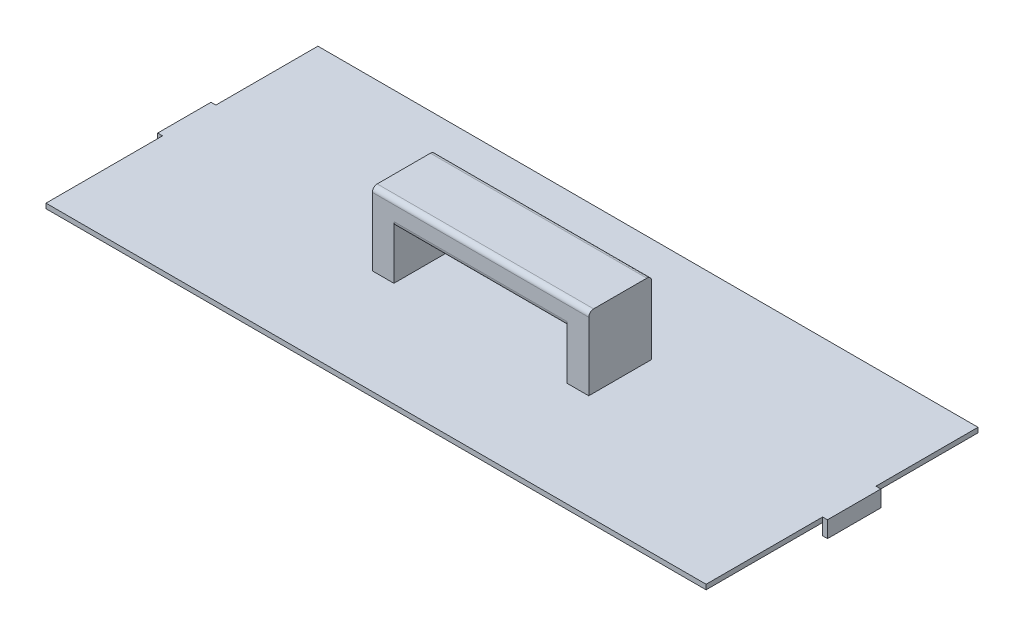
ISO-10303-21;
HEADER;
FILE_DESCRIPTION(('STEP AP214'),'2;1');
FILE_NAME('part.step','',(''),(''),'','','');
FILE_SCHEMA(('AUTOMOTIVE_DESIGN { 1 0 10303 214 1 1 1 1 }'));
ENDSEC;
DATA;
#1=APPLICATION_CONTEXT('core data for automotive mechanical design processes');
#2=APPLICATION_PROTOCOL_DEFINITION('international standard','automotive_design',2000,#1);
#3=PRODUCT_CONTEXT('',#1,'mechanical');
#4=PRODUCT('Part','Part','',(#3));
#5=PRODUCT_RELATED_PRODUCT_CATEGORY('part','',(#4));
#6=PRODUCT_DEFINITION_FORMATION('','',#4);
#7=PRODUCT_DEFINITION_CONTEXT('part definition',#1,'design');
#8=PRODUCT_DEFINITION('design','',#6,#7);
#9=PRODUCT_DEFINITION_SHAPE('','',#8);
#10=(LENGTH_UNIT() NAMED_UNIT(*) SI_UNIT(.MILLI.,.METRE.));
#11=(NAMED_UNIT(*) PLANE_ANGLE_UNIT() SI_UNIT($,.RADIAN.));
#12=(NAMED_UNIT(*) SI_UNIT($,.STERADIAN.) SOLID_ANGLE_UNIT());
#13=UNCERTAINTY_MEASURE_WITH_UNIT(LENGTH_MEASURE(1.E-05),#10,'distance_accuracy_value','');
#14=(GEOMETRIC_REPRESENTATION_CONTEXT(3) GLOBAL_UNCERTAINTY_ASSIGNED_CONTEXT((#13)) GLOBAL_UNIT_ASSIGNED_CONTEXT((#10,
#11,#12)) REPRESENTATION_CONTEXT('',''));
#15=CARTESIAN_POINT('',(0.,0.,0.));
#16=DIRECTION('',(0.,0.,1.));
#17=DIRECTION('',(1.,0.,0.));
#18=AXIS2_PLACEMENT_3D('',#15,#16,#17);
#19=CARTESIAN_POINT('',(76.9376083833033,1.,62.7820387129829));
#20=DIRECTION('',(-1.,0.,0.));
#21=DIRECTION('',(0.,0.,1.));
#22=AXIS2_PLACEMENT_3D('',#19,#20,#21);
#23=PLANE('',#22);
#24=DIRECTION('',(0.,1.,0.));
#25=VECTOR('',#24,1.);
#26=CARTESIAN_POINT('',(76.9376083833032,-2.37040463192349,29.8163482725759));
#27=LINE('',#26,#25);
#28=CARTESIAN_POINT('',(76.9376083833032,0.,29.8163482725759));
#29=VERTEX_POINT('',#28);
#30=CARTESIAN_POINT('',(76.937608383303,1.,29.8163482725759));
#31=VERTEX_POINT('',#30);
#32=EDGE_CURVE('E11',#29,#31,#27,.T.);
#33=ORIENTED_EDGE('',*,*,#32,.F.);
#34=DIRECTION('',(0.,0.,-1.));
#35=VECTOR('',#34,1.);
#36=CARTESIAN_POINT('',(76.9376083833033,0.,62.7820387129829));
#37=LINE('',#36,#35);
#38=CARTESIAN_POINT('',(76.9376083833031,0.,8.81087368901051));
#39=VERTEX_POINT('',#38);
#40=EDGE_CURVE('E384',#29,#39,#37,.T.);
#41=ORIENTED_EDGE('',*,*,#40,.T.);
#42=DIRECTION('',(0.,-1.,0.));
#43=VECTOR('',#42,1.);
#44=CARTESIAN_POINT('',(76.9376083833031,1.,8.81087368901051));
#45=LINE('',#44,#43);
#46=CARTESIAN_POINT('',(76.9376083833031,1.,8.81087368901051));
#47=VERTEX_POINT('',#46);
#48=EDGE_CURVE('E405',#47,#39,#45,.T.);
#49=ORIENTED_EDGE('',*,*,#48,.F.);
#50=DIRECTION('',(0.,0.,-1.));
#51=VECTOR('',#50,1.);
#52=CARTESIAN_POINT('',(76.9376083833033,1.,64.7684156513138));
#53=LINE('',#52,#51);
#54=EDGE_CURVE('E60',#31,#47,#53,.T.);
#55=ORIENTED_EDGE('',*,*,#54,.F.);
#56=EDGE_LOOP('',(#33,#41,#49,#55));
#57=FACE_BOUND('',#56,.T.);
#58=ADVANCED_FACE('F41',(#57),#23,.F.);
#59=DIRECTION('',(0.,-1.,0.));
#60=VECTOR('',#59,1.);
#61=CARTESIAN_POINT('',(76.9376083833032,1.,40.7849679925753));
#62=LINE('',#61,#60);
#63=CARTESIAN_POINT('',(76.9376083833031,1.,40.7849679925753));
#64=VERTEX_POINT('',#63);
#65=CARTESIAN_POINT('',(76.9376083833032,0.,40.7849679925753));
#66=VERTEX_POINT('',#65);
#67=EDGE_CURVE('E67',#64,#66,#62,.T.);
#68=ORIENTED_EDGE('',*,*,#67,.F.);
#69=CARTESIAN_POINT('',(76.9376083833033,1.,64.7684156513138));
#70=VERTEX_POINT('',#69);
#71=EDGE_CURVE('E242',#70,#64,#53,.T.);
#72=ORIENTED_EDGE('',*,*,#71,.F.);
#73=DIRECTION('',(0.,-1.,0.));
#74=VECTOR('',#73,1.);
#75=CARTESIAN_POINT('',(76.9376083833033,1.,64.7684156513138));
#76=LINE('',#75,#74);
#77=CARTESIAN_POINT('',(76.9376083833033,0.,64.7684156513138));
#78=VERTEX_POINT('',#77);
#79=EDGE_CURVE('E409',#70,#78,#76,.T.);
#80=ORIENTED_EDGE('',*,*,#79,.T.);
#81=EDGE_CURVE('E385',#78,#66,#37,.T.);
#82=ORIENTED_EDGE('',*,*,#81,.T.);
#83=EDGE_LOOP('',(#68,#72,#80,#82));
#84=FACE_BOUND('',#83,.T.);
#85=ADVANCED_FACE('F510',(#84),#23,.F.);
#86=CARTESIAN_POINT('',(-58.9111975848685,1.,62.792119939194));
#87=DIRECTION('',(1.,0.,0.));
#88=DIRECTION('',(0.,0.,-1.));
#89=AXIS2_PLACEMENT_3D('',#86,#87,#88);
#90=PLANE('',#89);
#91=DIRECTION('',(0.,-1.,0.));
#92=VECTOR('',#91,1.);
#93=CARTESIAN_POINT('',(-58.9111975848685,1.,29.8163482725764));
#94=LINE('',#93,#92);
#95=CARTESIAN_POINT('',(-58.9111975848684,1.,29.8163482725764));
#96=VERTEX_POINT('',#95);
#97=CARTESIAN_POINT('',(-58.9111975848685,0.,29.8163482725764));
#98=VERTEX_POINT('',#97);
#99=EDGE_CURVE('E249',#96,#98,#94,.T.);
#100=ORIENTED_EDGE('',*,*,#99,.F.);
#101=DIRECTION('',(0.,0.,1.));
#102=VECTOR('',#101,1.);
#103=CARTESIAN_POINT('',(-58.9111975848683,1.,8.81087368901051));
#104=LINE('',#103,#102);
#105=CARTESIAN_POINT('',(-58.9111975848683,1.,8.81087368901051));
#106=VERTEX_POINT('',#105);
#107=EDGE_CURVE('E376',#106,#96,#104,.T.);
#108=ORIENTED_EDGE('',*,*,#107,.F.);
#109=DIRECTION('',(0.,-1.,0.));
#110=VECTOR('',#109,1.);
#111=CARTESIAN_POINT('',(-58.9111975848683,1.,8.81087368901051));
#112=LINE('',#111,#110);
#113=CARTESIAN_POINT('',(-58.9111975848683,0.,8.81087368901051));
#114=VERTEX_POINT('',#113);
#115=EDGE_CURVE('E401',#106,#114,#112,.T.);
#116=ORIENTED_EDGE('',*,*,#115,.T.);
#117=DIRECTION('',(0.,0.,1.));
#118=VECTOR('',#117,1.);
#119=CARTESIAN_POINT('',(-58.9111975848685,0.,62.792119939194));
#120=LINE('',#119,#118);
#121=EDGE_CURVE('E369',#114,#98,#120,.T.);
#122=ORIENTED_EDGE('',*,*,#121,.T.);
#123=EDGE_LOOP('',(#100,#108,#116,#122));
#124=FACE_BOUND('',#123,.T.);
#125=ADVANCED_FACE('F512',(#124),#90,.F.);
#126=DIRECTION('',(0.,1.,0.));
#127=VECTOR('',#126,1.);
#128=CARTESIAN_POINT('',(-58.9111975848685,1.,40.7849679925758));
#129=LINE('',#128,#127);
#130=CARTESIAN_POINT('',(-58.9111975848685,0.,40.7849679925758));
#131=VERTEX_POINT('',#130);
#132=CARTESIAN_POINT('',(-58.9111975848685,1.,40.7849679925758));
#133=VERTEX_POINT('',#132);
#134=EDGE_CURVE('E51',#131,#133,#129,.T.);
#135=ORIENTED_EDGE('',*,*,#134,.F.);
#136=CARTESIAN_POINT('',(-58.9111975848685,0.,64.7684156513138));
#137=VERTEX_POINT('',#136);
#138=EDGE_CURVE('E393',#131,#137,#120,.T.);
#139=ORIENTED_EDGE('',*,*,#138,.T.);
#140=DIRECTION('',(0.,-1.,0.));
#141=VECTOR('',#140,1.);
#142=CARTESIAN_POINT('',(-58.9111975848685,1.,64.7684156513138));
#143=LINE('',#142,#141);
#144=CARTESIAN_POINT('',(-58.9111975848685,1.,64.7684156513138));
#145=VERTEX_POINT('',#144);
#146=EDGE_CURVE('E380',#145,#137,#143,.T.);
#147=ORIENTED_EDGE('',*,*,#146,.F.);
#148=EDGE_CURVE('E375',#133,#145,#104,.T.);
#149=ORIENTED_EDGE('',*,*,#148,.F.);
#150=EDGE_LOOP('',(#135,#139,#147,#149));
#151=FACE_BOUND('',#150,.T.);
#152=ADVANCED_FACE('F503',(#151),#90,.F.);
#153=CARTESIAN_POINT('',(0.,1.,0.));
#154=DIRECTION('',(0.,1.,0.));
#155=DIRECTION('',(0.,0.,1.));
#156=AXIS2_PLACEMENT_3D('',#153,#154,#155);
#157=PLANE('',#156);
#158=DIRECTION('',(1.,0.,0.));
#159=VECTOR('',#158,1.);
#160=CARTESIAN_POINT('',(-58.9111975848685,1.,64.7684156513138));
#161=LINE('',#160,#159);
#162=EDGE_CURVE('E366',#145,#70,#161,.T.);
#163=ORIENTED_EDGE('',*,*,#162,.T.);
#164=ORIENTED_EDGE('',*,*,#71,.T.);
#165=DIRECTION('',(-1.,0.,0.));
#166=VECTOR('',#165,1.);
#167=CARTESIAN_POINT('',(77.9376083833032,1.,40.7849679925753));
#168=LINE('',#167,#166);
#169=CARTESIAN_POINT('',(77.9376083833032,1.,40.7849679925753));
#170=VERTEX_POINT('',#169);
#171=EDGE_CURVE('E222',#170,#64,#168,.T.);
#172=ORIENTED_EDGE('',*,*,#171,.F.);
#173=DIRECTION('',(0.,0.,1.));
#174=VECTOR('',#173,1.);
#175=CARTESIAN_POINT('',(77.9376083833032,1.,29.8163482725759));
#176=LINE('',#175,#174);
#177=CARTESIAN_POINT('',(77.9376083833032,1.,29.8163482725759));
#178=VERTEX_POINT('',#177);
#179=EDGE_CURVE('E229',#178,#170,#176,.T.);
#180=ORIENTED_EDGE('',*,*,#179,.F.);
#181=DIRECTION('',(-1.,0.,0.));
#182=VECTOR('',#181,1.);
#183=CARTESIAN_POINT('',(77.9376083833032,1.,29.8163482725759));
#184=LINE('',#183,#182);
#185=EDGE_CURVE('E819',#178,#31,#184,.T.);
#186=ORIENTED_EDGE('',*,*,#185,.T.);
#187=ORIENTED_EDGE('',*,*,#54,.T.);
#188=DIRECTION('',(-1.,0.,0.));
#189=VECTOR('',#188,1.);
#190=CARTESIAN_POINT('',(-58.9111975848683,1.,8.81087368901051));
#191=LINE('',#190,#189);
#192=EDGE_CURVE('E372',#47,#106,#191,.T.);
#193=ORIENTED_EDGE('',*,*,#192,.T.);
#194=ORIENTED_EDGE('',*,*,#107,.T.);
#195=DIRECTION('',(1.,0.,0.));
#196=VECTOR('',#195,1.);
#197=CARTESIAN_POINT('',(-59.9111975848685,1.,29.8163482725764));
#198=LINE('',#197,#196);
#199=CARTESIAN_POINT('',(-59.9111975848685,1.,29.8163482725764));
#200=VERTEX_POINT('',#199);
#201=EDGE_CURVE('E268',#200,#96,#198,.T.);
#202=ORIENTED_EDGE('',*,*,#201,.F.);
#203=DIRECTION('',(0.,0.,-1.));
#204=VECTOR('',#203,1.);
#205=CARTESIAN_POINT('',(-59.9111975848685,1.,29.8163482725764));
#206=LINE('',#205,#204);
#207=CARTESIAN_POINT('',(-59.9111975848685,1.,40.7849679925758));
#208=VERTEX_POINT('',#207);
#209=EDGE_CURVE('E266',#208,#200,#206,.T.);
#210=ORIENTED_EDGE('',*,*,#209,.F.);
#211=DIRECTION('',(1.,0.,0.));
#212=VECTOR('',#211,1.);
#213=CARTESIAN_POINT('',(-59.9111975848685,1.,40.7849679925758));
#214=LINE('',#213,#212);
#215=EDGE_CURVE('E281',#208,#133,#214,.T.);
#216=ORIENTED_EDGE('',*,*,#215,.T.);
#217=ORIENTED_EDGE('',*,*,#148,.T.);
#218=EDGE_LOOP('',(#163,#164,#172,#180,#186,#187,#193,#194,#202,#210,#216,#217));
#219=FACE_BOUND('',#218,.T.);
#220=DIRECTION('',(1.,0.,0.));
#221=VECTOR('',#220,1.);
#222=CARTESIAN_POINT('',(-13.2544041896297,1.,43.2606217288818));
#223=LINE('',#222,#221);
#224=CARTESIAN_POINT('',(-13.2544041896297,1.,43.2606217288818));
#225=VERTEX_POINT('',#224);
#226=CARTESIAN_POINT('',(-8.82153302110664,1.,43.2606217288818));
#227=VERTEX_POINT('',#226);
#228=EDGE_CURVE('E357',#225,#227,#223,.T.);
#229=ORIENTED_EDGE('',*,*,#228,.F.);
#230=DIRECTION('',(0.,0.,1.));
#231=VECTOR('',#230,1.);
#232=CARTESIAN_POINT('',(-13.2544041896297,1.,43.2606217288818));
#233=LINE('',#232,#231);
#234=CARTESIAN_POINT('',(-13.2544041896297,1.,30.3186676114426));
#235=VERTEX_POINT('',#234);
#236=EDGE_CURVE('E313',#235,#225,#233,.T.);
#237=ORIENTED_EDGE('',*,*,#236,.F.);
#238=DIRECTION('',(-1.,0.,0.));
#239=VECTOR('',#238,1.);
#240=CARTESIAN_POINT('',(-13.2544041896297,1.,30.3186676114426));
#241=LINE('',#240,#239);
#242=CARTESIAN_POINT('',(-8.82153302110665,1.,30.3186676114426));
#243=VERTEX_POINT('',#242);
#244=EDGE_CURVE('E349',#243,#235,#241,.T.);
#245=ORIENTED_EDGE('',*,*,#244,.F.);
#246=DIRECTION('',(0.,0.,-1.));
#247=VECTOR('',#246,1.);
#248=CARTESIAN_POINT('',(-8.82153302110664,1.,43.2606217288818));
#249=LINE('',#248,#247);
#250=EDGE_CURVE('E353',#227,#243,#249,.T.);
#251=ORIENTED_EDGE('',*,*,#250,.F.);
#252=EDGE_LOOP('',(#229,#237,#245,#251));
#253=FACE_BOUND('',#252,.T.);
#254=DIRECTION('',(1.,0.,0.));
#255=VECTOR('',#254,1.);
#256=CARTESIAN_POINT('',(31.2808149880645,1.,43.2606217288818));
#257=LINE('',#256,#255);
#258=CARTESIAN_POINT('',(26.8479438195414,1.,43.2606217288818));
#259=VERTEX_POINT('',#258);
#260=CARTESIAN_POINT('',(31.2808149880645,1.,43.2606217288818));
#261=VERTEX_POINT('',#260);
#262=EDGE_CURVE('E312',#259,#261,#257,.T.);
#263=ORIENTED_EDGE('',*,*,#262,.F.);
#264=DIRECTION('',(0.,0.,1.));
#265=VECTOR('',#264,1.);
#266=CARTESIAN_POINT('',(26.8479438195414,1.,43.2606217288818));
#267=LINE('',#266,#265);
#268=CARTESIAN_POINT('',(26.8479438195414,1.,30.3186676114426));
#269=VERTEX_POINT('',#268);
#270=EDGE_CURVE('E308',#269,#259,#267,.T.);
#271=ORIENTED_EDGE('',*,*,#270,.F.);
#272=DIRECTION('',(-1.,0.,0.));
#273=VECTOR('',#272,1.);
#274=CARTESIAN_POINT('',(31.2808149880645,1.,30.3186676114426));
#275=LINE('',#274,#273);
#276=CARTESIAN_POINT('',(31.2808149880645,1.,30.3186676114426));
#277=VERTEX_POINT('',#276);
#278=EDGE_CURVE('E307',#277,#269,#275,.T.);
#279=ORIENTED_EDGE('',*,*,#278,.F.);
#280=DIRECTION('',(0.,0.,-1.));
#281=VECTOR('',#280,1.);
#282=CARTESIAN_POINT('',(31.2808149880645,1.,43.2606217288818));
#283=LINE('',#282,#281);
#284=EDGE_CURVE('E317',#261,#277,#283,.T.);
#285=ORIENTED_EDGE('',*,*,#284,.F.);
#286=EDGE_LOOP('',(#263,#271,#279,#285));
#287=FACE_BOUND('',#286,.T.);
#288=ADVANCED_FACE('F240',(#219,#253,#287),#157,.T.);
#289=CARTESIAN_POINT('',(74.598736982149,1.,64.7684156513139));
#290=DIRECTION('',(0.,0.,-1.));
#291=DIRECTION('',(-1.,0.,0.));
#292=AXIS2_PLACEMENT_3D('',#289,#290,#291);
#293=PLANE('',#292);
#294=DIRECTION('',(1.,0.,0.));
#295=VECTOR('',#294,1.);
#296=CARTESIAN_POINT('',(74.598736982149,0.,64.7684156513139));
#297=LINE('',#296,#295);
#298=EDGE_CURVE('E335',#137,#78,#297,.T.);
#299=ORIENTED_EDGE('',*,*,#298,.T.);
#300=ORIENTED_EDGE('',*,*,#79,.F.);
#301=ORIENTED_EDGE('',*,*,#162,.F.);
#302=ORIENTED_EDGE('',*,*,#146,.T.);
#303=EDGE_LOOP('',(#299,#300,#301,#302));
#304=FACE_BOUND('',#303,.T.);
#305=ADVANCED_FACE('F509',(#304),#293,.F.);
#306=CARTESIAN_POINT('',(-58.9111975848683,1.,8.81087368901051));
#307=DIRECTION('',(0.,0.,1.));
#308=DIRECTION('',(1.,0.,0.));
#309=AXIS2_PLACEMENT_3D('',#306,#307,#308);
#310=PLANE('',#309);
#311=DIRECTION('',(-1.,0.,0.));
#312=VECTOR('',#311,1.);
#313=CARTESIAN_POINT('',(-58.9111975848683,0.,8.81087368901051));
#314=LINE('',#313,#312);
#315=EDGE_CURVE('E388',#39,#114,#314,.T.);
#316=ORIENTED_EDGE('',*,*,#315,.T.);
#317=ORIENTED_EDGE('',*,*,#115,.F.);
#318=ORIENTED_EDGE('',*,*,#192,.F.);
#319=ORIENTED_EDGE('',*,*,#48,.T.);
#320=EDGE_LOOP('',(#316,#317,#318,#319));
#321=FACE_BOUND('',#320,.T.);
#322=ADVANCED_FACE('F523',(#321),#310,.F.);
#323=CARTESIAN_POINT('',(0.,0.,0.));
#324=DIRECTION('',(0.,1.,0.));
#325=DIRECTION('',(0.,0.,1.));
#326=AXIS2_PLACEMENT_3D('',#323,#324,#325);
#327=PLANE('',#326);
#328=ORIENTED_EDGE('',*,*,#298,.F.);
#329=ORIENTED_EDGE('',*,*,#138,.F.);
#330=EDGE_CURVE('E397',#98,#131,#120,.T.);
#331=ORIENTED_EDGE('',*,*,#330,.F.);
#332=ORIENTED_EDGE('',*,*,#121,.F.);
#333=ORIENTED_EDGE('',*,*,#315,.F.);
#334=ORIENTED_EDGE('',*,*,#40,.F.);
#335=EDGE_CURVE('E389',#66,#29,#37,.T.);
#336=ORIENTED_EDGE('',*,*,#335,.F.);
#337=ORIENTED_EDGE('',*,*,#81,.F.);
#338=EDGE_LOOP('',(#328,#329,#331,#332,#333,#334,#336,#337));
#339=FACE_BOUND('',#338,.T.);
#340=ADVANCED_FACE('F505',(#339),#327,.F.);
#341=CARTESIAN_POINT('',(-13.2544041896297,11.,43.2606217288818));
#342=DIRECTION('',(1.,0.,0.));
#343=DIRECTION('',(0.,0.,-1.));
#344=AXIS2_PLACEMENT_3D('',#341,#342,#343);
#345=PLANE('',#344);
#346=DIRECTION('',(0.,0.,1.));
#347=VECTOR('',#346,1.);
#348=CARTESIAN_POINT('',(-13.2544041896297,16.,30.3186676114426));
#349=LINE('',#348,#347);
#350=CARTESIAN_POINT('',(-13.2544041896297,16.,31.3186676114426));
#351=VERTEX_POINT('',#350);
#352=CARTESIAN_POINT('',(-13.2544041896297,16.,42.2606217288818));
#353=VERTEX_POINT('',#352);
#354=EDGE_CURVE('E297',#351,#353,#349,.T.);
#355=ORIENTED_EDGE('',*,*,#354,.F.);
#356=CARTESIAN_POINT('',(-13.2544041896297,15.,31.3186676114426));
#357=DIRECTION('',(1.,0.,0.));
#358=DIRECTION('',(0.,0.,-1.));
#359=AXIS2_PLACEMENT_3D('',#356,#357,#358);
#360=CIRCLE('',#359,1.);
#361=CARTESIAN_POINT('',(-13.2544041896297,15.,30.3186676114426));
#362=VERTEX_POINT('',#361);
#363=EDGE_CURVE('E433',#351,#362,#360,.F.);
#364=ORIENTED_EDGE('',*,*,#363,.T.);
#365=DIRECTION('',(0.,-1.,0.));
#366=VECTOR('',#365,1.);
#367=CARTESIAN_POINT('',(-13.2544041896297,11.,30.3186676114426));
#368=LINE('',#367,#366);
#369=EDGE_CURVE('E345',#362,#235,#368,.T.);
#370=ORIENTED_EDGE('',*,*,#369,.T.);
#371=ORIENTED_EDGE('',*,*,#236,.T.);
#372=DIRECTION('',(0.,-1.,0.));
#373=VECTOR('',#372,1.);
#374=CARTESIAN_POINT('',(-13.2544041896297,11.,43.2606217288818));
#375=LINE('',#374,#373);
#376=CARTESIAN_POINT('',(-13.2544041896297,15.,43.2606217288818));
#377=VERTEX_POINT('',#376);
#378=EDGE_CURVE('E301',#377,#225,#375,.T.);
#379=ORIENTED_EDGE('',*,*,#378,.F.);
#380=CARTESIAN_POINT('',(-13.2544041896297,15.,42.2606217288818));
#381=DIRECTION('',(1.,0.,0.));
#382=DIRECTION('',(0.,0.,-1.));
#383=AXIS2_PLACEMENT_3D('',#380,#381,#382);
#384=CIRCLE('',#383,1.);
#385=EDGE_CURVE('E430',#377,#353,#384,.F.);
#386=ORIENTED_EDGE('',*,*,#385,.T.);
#387=EDGE_LOOP('',(#355,#364,#370,#371,#379,#386));
#388=FACE_BOUND('',#387,.T.);
#389=ADVANCED_FACE('F571',(#388),#345,.F.);
#390=CARTESIAN_POINT('',(-8.82153302110664,11.,43.2606217288818));
#391=DIRECTION('',(-1.,0.,0.));
#392=DIRECTION('',(0.,0.,1.));
#393=AXIS2_PLACEMENT_3D('',#390,#391,#392);
#394=PLANE('',#393);
#395=ORIENTED_EDGE('',*,*,#250,.T.);
#396=DIRECTION('',(0.,-1.,0.));
#397=VECTOR('',#396,1.);
#398=CARTESIAN_POINT('',(-8.82153302110665,11.,30.3186676114426));
#399=LINE('',#398,#397);
#400=CARTESIAN_POINT('',(-8.82153302110665,12.,30.3186676114426));
#401=VERTEX_POINT('',#400);
#402=EDGE_CURVE('E342',#401,#243,#399,.T.);
#403=ORIENTED_EDGE('',*,*,#402,.F.);
#404=CARTESIAN_POINT('',(-8.82153302110665,12.,31.3186676114426));
#405=DIRECTION('',(-1.,0.,0.));
#406=DIRECTION('',(0.,0.,1.));
#407=AXIS2_PLACEMENT_3D('',#404,#405,#406);
#408=CIRCLE('',#407,1.);
#409=CARTESIAN_POINT('',(-8.82153302110665,11.,31.3186676114426));
#410=VERTEX_POINT('',#409);
#411=EDGE_CURVE('E458',#401,#410,#408,.T.);
#412=ORIENTED_EDGE('',*,*,#411,.T.);
#413=DIRECTION('',(0.,0.,-1.));
#414=VECTOR('',#413,1.);
#415=CARTESIAN_POINT('',(-8.82153302110664,11.,43.2606217288818));
#416=LINE('',#415,#414);
#417=CARTESIAN_POINT('',(-8.82153302110664,11.,42.2606217288818));
#418=VERTEX_POINT('',#417);
#419=EDGE_CURVE('E348',#418,#410,#416,.T.);
#420=ORIENTED_EDGE('',*,*,#419,.F.);
#421=CARTESIAN_POINT('',(-8.82153302110664,12.,42.2606217288818));
#422=DIRECTION('',(-1.,0.,0.));
#423=DIRECTION('',(0.,0.,1.));
#424=AXIS2_PLACEMENT_3D('',#421,#422,#423);
#425=CIRCLE('',#424,1.);
#426=CARTESIAN_POINT('',(-8.82153302110664,12.,43.2606217288818));
#427=VERTEX_POINT('',#426);
#428=EDGE_CURVE('E45',#418,#427,#425,.T.);
#429=ORIENTED_EDGE('',*,*,#428,.T.);
#430=DIRECTION('',(0.,-1.,0.));
#431=VECTOR('',#430,1.);
#432=CARTESIAN_POINT('',(-8.82153302110664,11.,43.2606217288818));
#433=LINE('',#432,#431);
#434=EDGE_CURVE('E338',#427,#227,#433,.T.);
#435=ORIENTED_EDGE('',*,*,#434,.T.);
#436=EDGE_LOOP('',(#395,#403,#412,#420,#429,#435));
#437=FACE_BOUND('',#436,.T.);
#438=ADVANCED_FACE('F545',(#437),#394,.F.);
#439=CARTESIAN_POINT('',(26.8479438195414,11.,43.2606217288818));
#440=DIRECTION('',(1.,0.,0.));
#441=DIRECTION('',(0.,0.,-1.));
#442=AXIS2_PLACEMENT_3D('',#439,#440,#441);
#443=PLANE('',#442);
#444=ORIENTED_EDGE('',*,*,#270,.T.);
#445=DIRECTION('',(0.,-1.,0.));
#446=VECTOR('',#445,1.);
#447=CARTESIAN_POINT('',(26.8479438195414,11.,43.2606217288818));
#448=LINE('',#447,#446);
#449=CARTESIAN_POINT('',(26.8479438195414,12.,43.2606217288818));
#450=VERTEX_POINT('',#449);
#451=EDGE_CURVE('E332',#450,#259,#448,.T.);
#452=ORIENTED_EDGE('',*,*,#451,.F.);
#453=CARTESIAN_POINT('',(26.8479438195414,12.,42.2606217288818));
#454=DIRECTION('',(1.,0.,0.));
#455=DIRECTION('',(0.,0.,-1.));
#456=AXIS2_PLACEMENT_3D('',#453,#454,#455);
#457=CIRCLE('',#456,1.);
#458=CARTESIAN_POINT('',(26.8479438195414,11.,42.2606217288818));
#459=VERTEX_POINT('',#458);
#460=EDGE_CURVE('E460',#450,#459,#457,.T.);
#461=ORIENTED_EDGE('',*,*,#460,.T.);
#462=DIRECTION('',(0.,0.,1.));
#463=VECTOR('',#462,1.);
#464=CARTESIAN_POINT('',(26.8479438195414,11.,43.2606217288818));
#465=LINE('',#464,#463);
#466=CARTESIAN_POINT('',(26.8479438195414,11.,31.3186676114426));
#467=VERTEX_POINT('',#466);
#468=EDGE_CURVE('E302',#467,#459,#465,.T.);
#469=ORIENTED_EDGE('',*,*,#468,.F.);
#470=CARTESIAN_POINT('',(26.8479438195414,12.,31.3186676114426));
#471=DIRECTION('',(1.,0.,0.));
#472=DIRECTION('',(0.,0.,-1.));
#473=AXIS2_PLACEMENT_3D('',#470,#471,#472);
#474=CIRCLE('',#473,1.);
#475=CARTESIAN_POINT('',(26.8479438195414,12.,30.3186676114426));
#476=VERTEX_POINT('',#475);
#477=EDGE_CURVE('E454',#467,#476,#474,.T.);
#478=ORIENTED_EDGE('',*,*,#477,.T.);
#479=DIRECTION('',(0.,-1.,0.));
#480=VECTOR('',#479,1.);
#481=CARTESIAN_POINT('',(26.8479438195414,11.,30.3186676114426));
#482=LINE('',#481,#480);
#483=EDGE_CURVE('E306',#476,#269,#482,.T.);
#484=ORIENTED_EDGE('',*,*,#483,.T.);
#485=EDGE_LOOP('',(#444,#452,#461,#469,#478,#484));
#486=FACE_BOUND('',#485,.T.);
#487=ADVANCED_FACE('F561',(#486),#443,.F.);
#488=CARTESIAN_POINT('',(31.2808149880645,11.,43.2606217288818));
#489=DIRECTION('',(0.,0.,-1.));
#490=DIRECTION('',(-1.,0.,0.));
#491=AXIS2_PLACEMENT_3D('',#488,#489,#490);
#492=PLANE('',#491);
#493=DIRECTION('',(1.,0.,0.));
#494=VECTOR('',#493,1.);
#495=CARTESIAN_POINT('',(26.8479438195414,12.,43.2606217288818));
#496=LINE('',#495,#494);
#497=EDGE_CURVE('E450',#427,#450,#496,.T.);
#498=ORIENTED_EDGE('',*,*,#497,.T.);
#499=ORIENTED_EDGE('',*,*,#451,.T.);
#500=ORIENTED_EDGE('',*,*,#262,.T.);
#501=DIRECTION('',(0.,-1.,0.));
#502=VECTOR('',#501,1.);
#503=CARTESIAN_POINT('',(31.2808149880645,11.,43.2606217288818));
#504=LINE('',#503,#502);
#505=CARTESIAN_POINT('',(31.2808149880645,15.,43.2606217288818));
#506=VERTEX_POINT('',#505);
#507=EDGE_CURVE('E329',#506,#261,#504,.T.);
#508=ORIENTED_EDGE('',*,*,#507,.F.);
#509=DIRECTION('',(1.,0.,0.));
#510=VECTOR('',#509,1.);
#511=CARTESIAN_POINT('',(31.2808149880645,15.,43.2606217288818));
#512=LINE('',#511,#510);
#513=EDGE_CURVE('E436',#506,#377,#512,.F.);
#514=ORIENTED_EDGE('',*,*,#513,.T.);
#515=ORIENTED_EDGE('',*,*,#378,.T.);
#516=ORIENTED_EDGE('',*,*,#228,.T.);
#517=ORIENTED_EDGE('',*,*,#434,.F.);
#518=EDGE_LOOP('',(#498,#499,#500,#508,#514,#515,#516,#517));
#519=FACE_BOUND('',#518,.T.);
#520=ADVANCED_FACE('F549',(#519),#492,.F.);
#521=CARTESIAN_POINT('',(31.2808149880645,11.,43.2606217288818));
#522=DIRECTION('',(-1.,0.,0.));
#523=DIRECTION('',(0.,0.,1.));
#524=AXIS2_PLACEMENT_3D('',#521,#522,#523);
#525=PLANE('',#524);
#526=DIRECTION('',(0.,-1.,0.));
#527=VECTOR('',#526,1.);
#528=CARTESIAN_POINT('',(31.2808149880645,11.,30.3186676114426));
#529=LINE('',#528,#527);
#530=CARTESIAN_POINT('',(31.2808149880645,15.,30.3186676114426));
#531=VERTEX_POINT('',#530);
#532=EDGE_CURVE('E326',#531,#277,#529,.T.);
#533=ORIENTED_EDGE('',*,*,#532,.F.);
#534=CARTESIAN_POINT('',(31.2808149880645,15.,31.3186676114426));
#535=DIRECTION('',(-1.,0.,0.));
#536=DIRECTION('',(0.,0.,1.));
#537=AXIS2_PLACEMENT_3D('',#534,#535,#536);
#538=CIRCLE('',#537,1.);
#539=CARTESIAN_POINT('',(31.2808149880645,16.,31.3186676114426));
#540=VERTEX_POINT('',#539);
#541=EDGE_CURVE('E420',#531,#540,#538,.F.);
#542=ORIENTED_EDGE('',*,*,#541,.T.);
#543=DIRECTION('',(0.,0.,1.));
#544=VECTOR('',#543,1.);
#545=CARTESIAN_POINT('',(31.2808149880645,16.,30.3186676114426));
#546=LINE('',#545,#544);
#547=CARTESIAN_POINT('',(31.2808149880645,16.,42.2606217288818));
#548=VERTEX_POINT('',#547);
#549=EDGE_CURVE('E293',#540,#548,#546,.T.);
#550=ORIENTED_EDGE('',*,*,#549,.T.);
#551=CARTESIAN_POINT('',(31.2808149880645,15.,42.2606217288818));
#552=DIRECTION('',(-1.,0.,0.));
#553=DIRECTION('',(0.,0.,1.));
#554=AXIS2_PLACEMENT_3D('',#551,#552,#553);
#555=CIRCLE('',#554,1.);
#556=EDGE_CURVE('E417',#548,#506,#555,.F.);
#557=ORIENTED_EDGE('',*,*,#556,.T.);
#558=ORIENTED_EDGE('',*,*,#507,.T.);
#559=ORIENTED_EDGE('',*,*,#284,.T.);
#560=EDGE_LOOP('',(#533,#542,#550,#557,#558,#559));
#561=FACE_BOUND('',#560,.T.);
#562=ADVANCED_FACE('F569',(#561),#525,.F.);
#563=CARTESIAN_POINT('',(31.2808149880645,11.,30.3186676114426));
#564=DIRECTION('',(0.,0.,1.));
#565=DIRECTION('',(1.,0.,0.));
#566=AXIS2_PLACEMENT_3D('',#563,#564,#565);
#567=PLANE('',#566);
#568=ORIENTED_EDGE('',*,*,#483,.F.);
#569=DIRECTION('',(1.,0.,0.));
#570=VECTOR('',#569,1.);
#571=CARTESIAN_POINT('',(-8.82153302110665,12.,30.3186676114426));
#572=LINE('',#571,#570);
#573=EDGE_CURVE('E446',#476,#401,#572,.F.);
#574=ORIENTED_EDGE('',*,*,#573,.T.);
#575=ORIENTED_EDGE('',*,*,#402,.T.);
#576=ORIENTED_EDGE('',*,*,#244,.T.);
#577=ORIENTED_EDGE('',*,*,#369,.F.);
#578=DIRECTION('',(1.,0.,0.));
#579=VECTOR('',#578,1.);
#580=CARTESIAN_POINT('',(31.2808149880645,15.,30.3186676114426));
#581=LINE('',#580,#579);
#582=EDGE_CURVE('E413',#362,#531,#581,.T.);
#583=ORIENTED_EDGE('',*,*,#582,.T.);
#584=ORIENTED_EDGE('',*,*,#532,.T.);
#585=ORIENTED_EDGE('',*,*,#278,.T.);
#586=EDGE_LOOP('',(#568,#574,#575,#576,#577,#583,#584,#585));
#587=FACE_BOUND('',#586,.T.);
#588=ADVANCED_FACE('F557',(#587),#567,.F.);
#589=CARTESIAN_POINT('',(0.,16.,0.));
#590=DIRECTION('',(0.,-1.,0.));
#591=DIRECTION('',(0.,0.,-1.));
#592=AXIS2_PLACEMENT_3D('',#589,#590,#591);
#593=PLANE('',#592);
#594=ORIENTED_EDGE('',*,*,#549,.F.);
#595=DIRECTION('',(1.,0.,0.));
#596=VECTOR('',#595,1.);
#597=CARTESIAN_POINT('',(0.,16.,31.3186676114426));
#598=LINE('',#597,#596);
#599=EDGE_CURVE('E427',#540,#351,#598,.F.);
#600=ORIENTED_EDGE('',*,*,#599,.T.);
#601=ORIENTED_EDGE('',*,*,#354,.T.);
#602=DIRECTION('',(1.,0.,0.));
#603=VECTOR('',#602,1.);
#604=CARTESIAN_POINT('',(0.,16.,42.2606217288818));
#605=LINE('',#604,#603);
#606=EDGE_CURVE('E423',#353,#548,#605,.T.);
#607=ORIENTED_EDGE('',*,*,#606,.T.);
#608=EDGE_LOOP('',(#594,#600,#601,#607));
#609=FACE_BOUND('',#608,.T.);
#610=ADVANCED_FACE('F605',(#609),#593,.F.);
#611=CARTESIAN_POINT('',(0.,11.,0.));
#612=DIRECTION('',(0.,-1.,0.));
#613=DIRECTION('',(0.,0.,-1.));
#614=AXIS2_PLACEMENT_3D('',#611,#612,#613);
#615=PLANE('',#614);
#616=ORIENTED_EDGE('',*,*,#419,.T.);
#617=DIRECTION('',(1.,0.,0.));
#618=VECTOR('',#617,1.);
#619=CARTESIAN_POINT('',(26.8479438195414,11.,31.3186676114426));
#620=LINE('',#619,#618);
#621=EDGE_CURVE('E442',#410,#467,#620,.T.);
#622=ORIENTED_EDGE('',*,*,#621,.T.);
#623=ORIENTED_EDGE('',*,*,#468,.T.);
#624=DIRECTION('',(1.,0.,0.));
#625=VECTOR('',#624,1.);
#626=CARTESIAN_POINT('',(-8.82153302110664,11.,42.2606217288818));
#627=LINE('',#626,#625);
#628=EDGE_CURVE('E439',#459,#418,#627,.F.);
#629=ORIENTED_EDGE('',*,*,#628,.T.);
#630=EDGE_LOOP('',(#616,#622,#623,#629));
#631=FACE_BOUND('',#630,.T.);
#632=ADVANCED_FACE('F530',(#631),#615,.T.);
#633=CARTESIAN_POINT('',(31.2808149880645,15.,31.3186676114426));
#634=DIRECTION('',(1.,0.,0.));
#635=DIRECTION('',(0.,0.,-1.));
#636=AXIS2_PLACEMENT_3D('',#633,#634,#635);
#637=CYLINDRICAL_SURFACE('',#636,1.);
#638=ORIENTED_EDGE('',*,*,#363,.F.);
#639=ORIENTED_EDGE('',*,*,#599,.F.);
#640=ORIENTED_EDGE('',*,*,#541,.F.);
#641=ORIENTED_EDGE('',*,*,#582,.F.);
#642=EDGE_LOOP('',(#638,#639,#640,#641));
#643=FACE_BOUND('',#642,.T.);
#644=ADVANCED_FACE('F526',(#643),#637,.T.);
#645=CARTESIAN_POINT('',(0.,15.,42.2606217288818));
#646=DIRECTION('',(1.,0.,0.));
#647=DIRECTION('',(0.,0.,-1.));
#648=AXIS2_PLACEMENT_3D('',#645,#646,#647);
#649=CYLINDRICAL_SURFACE('',#648,1.);
#650=ORIENTED_EDGE('',*,*,#385,.F.);
#651=ORIENTED_EDGE('',*,*,#513,.F.);
#652=ORIENTED_EDGE('',*,*,#556,.F.);
#653=ORIENTED_EDGE('',*,*,#606,.F.);
#654=EDGE_LOOP('',(#650,#651,#652,#653));
#655=FACE_BOUND('',#654,.T.);
#656=ADVANCED_FACE('F529',(#655),#649,.T.);
#657=CARTESIAN_POINT('',(0.,12.,31.3186676114426));
#658=DIRECTION('',(-1.,0.,0.));
#659=DIRECTION('',(0.,0.,1.));
#660=AXIS2_PLACEMENT_3D('',#657,#658,#659);
#661=CYLINDRICAL_SURFACE('',#660,1.);
#662=ORIENTED_EDGE('',*,*,#411,.F.);
#663=ORIENTED_EDGE('',*,*,#573,.F.);
#664=ORIENTED_EDGE('',*,*,#477,.F.);
#665=ORIENTED_EDGE('',*,*,#621,.F.);
#666=EDGE_LOOP('',(#662,#663,#664,#665));
#667=FACE_BOUND('',#666,.T.);
#668=ADVANCED_FACE('F533',(#667),#661,.T.);
#669=CARTESIAN_POINT('',(31.2808149880645,12.,42.2606217288818));
#670=DIRECTION('',(-1.,0.,0.));
#671=DIRECTION('',(0.,0.,1.));
#672=AXIS2_PLACEMENT_3D('',#669,#670,#671);
#673=CYLINDRICAL_SURFACE('',#672,1.);
#674=ORIENTED_EDGE('',*,*,#428,.F.);
#675=ORIENTED_EDGE('',*,*,#628,.F.);
#676=ORIENTED_EDGE('',*,*,#460,.F.);
#677=ORIENTED_EDGE('',*,*,#497,.F.);
#678=EDGE_LOOP('',(#674,#675,#676,#677));
#679=FACE_BOUND('',#678,.T.);
#680=ADVANCED_FACE('F43',(#679),#673,.T.);
#681=CARTESIAN_POINT('',(-58.9111975848685,0.,0.));
#682=DIRECTION('',(-1.,0.,0.));
#683=DIRECTION('',(0.,0.,1.));
#684=AXIS2_PLACEMENT_3D('',#681,#682,#683);
#685=PLANE('',#684);
#686=CARTESIAN_POINT('',(-58.9111975848685,-2.37040463192349,29.8163482725764));
#687=VERTEX_POINT('',#686);
#688=EDGE_CURVE('E244',#98,#687,#94,.T.);
#689=ORIENTED_EDGE('',*,*,#688,.F.);
#690=ORIENTED_EDGE('',*,*,#330,.T.);
#691=CARTESIAN_POINT('',(-58.9111975848685,-2.37040463192349,40.7849679925758));
#692=VERTEX_POINT('',#691);
#693=EDGE_CURVE('E260',#692,#131,#129,.T.);
#694=ORIENTED_EDGE('',*,*,#693,.F.);
#695=DIRECTION('',(0.,0.,1.));
#696=VECTOR('',#695,1.);
#697=CARTESIAN_POINT('',(-58.9111975848685,-2.37040463192349,29.8163482725764));
#698=LINE('',#697,#696);
#699=EDGE_CURVE('E272',#687,#692,#698,.T.);
#700=ORIENTED_EDGE('',*,*,#699,.F.);
#701=EDGE_LOOP('',(#689,#690,#694,#700));
#702=FACE_BOUND('',#701,.T.);
#703=ADVANCED_FACE('F496',(#702),#685,.F.);
#704=CARTESIAN_POINT('',(-59.9111975848685,1.,29.8163482725764));
#705=DIRECTION('',(0.,0.,1.));
#706=DIRECTION('',(1.,0.,0.));
#707=AXIS2_PLACEMENT_3D('',#704,#705,#706);
#708=PLANE('',#707);
#709=ORIENTED_EDGE('',*,*,#99,.T.);
#710=ORIENTED_EDGE('',*,*,#688,.T.);
#711=DIRECTION('',(1.,0.,0.));
#712=VECTOR('',#711,1.);
#713=CARTESIAN_POINT('',(-59.9111975848685,-2.37040463192349,29.8163482725764));
#714=LINE('',#713,#712);
#715=CARTESIAN_POINT('',(-59.9111975848685,-2.37040463192349,29.8163482725764));
#716=VERTEX_POINT('',#715);
#717=EDGE_CURVE('E289',#716,#687,#714,.T.);
#718=ORIENTED_EDGE('',*,*,#717,.F.);
#719=DIRECTION('',(0.,-1.,0.));
#720=VECTOR('',#719,1.);
#721=CARTESIAN_POINT('',(-59.9111975848685,1.,29.8163482725764));
#722=LINE('',#721,#720);
#723=EDGE_CURVE('E255',#200,#716,#722,.T.);
#724=ORIENTED_EDGE('',*,*,#723,.F.);
#725=ORIENTED_EDGE('',*,*,#201,.T.);
#726=EDGE_LOOP('',(#709,#710,#718,#724,#725));
#727=FACE_BOUND('',#726,.T.);
#728=ADVANCED_FACE('F593',(#727),#708,.F.);
#729=CARTESIAN_POINT('',(-59.9111975848685,-2.37040463192349,29.8163482725764));
#730=DIRECTION('',(0.,1.,0.));
#731=DIRECTION('',(0.,0.,1.));
#732=AXIS2_PLACEMENT_3D('',#729,#730,#731);
#733=PLANE('',#732);
#734=ORIENTED_EDGE('',*,*,#699,.T.);
#735=DIRECTION('',(1.,0.,0.));
#736=VECTOR('',#735,1.);
#737=CARTESIAN_POINT('',(-59.9111975848685,-2.37040463192349,40.7849679925758));
#738=LINE('',#737,#736);
#739=CARTESIAN_POINT('',(-59.9111975848685,-2.37040463192349,40.7849679925758));
#740=VERTEX_POINT('',#739);
#741=EDGE_CURVE('E285',#740,#692,#738,.T.);
#742=ORIENTED_EDGE('',*,*,#741,.F.);
#743=DIRECTION('',(0.,0.,1.));
#744=VECTOR('',#743,1.);
#745=CARTESIAN_POINT('',(-59.9111975848685,-2.37040463192349,29.8163482725764));
#746=LINE('',#745,#744);
#747=EDGE_CURVE('E259',#716,#740,#746,.T.);
#748=ORIENTED_EDGE('',*,*,#747,.F.);
#749=ORIENTED_EDGE('',*,*,#717,.T.);
#750=EDGE_LOOP('',(#734,#742,#748,#749));
#751=FACE_BOUND('',#750,.T.);
#752=ADVANCED_FACE('F594',(#751),#733,.F.);
#753=CARTESIAN_POINT('',(-59.9111975848685,1.,40.7849679925758));
#754=DIRECTION('',(0.,0.,-1.));
#755=DIRECTION('',(-1.,0.,0.));
#756=AXIS2_PLACEMENT_3D('',#753,#754,#755);
#757=PLANE('',#756);
#758=ORIENTED_EDGE('',*,*,#693,.T.);
#759=ORIENTED_EDGE('',*,*,#134,.T.);
#760=ORIENTED_EDGE('',*,*,#215,.F.);
#761=DIRECTION('',(0.,1.,0.));
#762=VECTOR('',#761,1.);
#763=CARTESIAN_POINT('',(-59.9111975848685,1.,40.7849679925758));
#764=LINE('',#763,#762);
#765=EDGE_CURVE('E263',#740,#208,#764,.T.);
#766=ORIENTED_EDGE('',*,*,#765,.F.);
#767=ORIENTED_EDGE('',*,*,#741,.T.);
#768=EDGE_LOOP('',(#758,#759,#760,#766,#767));
#769=FACE_BOUND('',#768,.T.);
#770=ADVANCED_FACE('F478',(#769),#757,.F.);
#771=CARTESIAN_POINT('',(-59.9111975848685,0.,0.));
#772=DIRECTION('',(-1.,0.,0.));
#773=DIRECTION('',(0.,0.,1.));
#774=AXIS2_PLACEMENT_3D('',#771,#772,#773);
#775=PLANE('',#774);
#776=ORIENTED_EDGE('',*,*,#723,.T.);
#777=ORIENTED_EDGE('',*,*,#747,.T.);
#778=ORIENTED_EDGE('',*,*,#765,.T.);
#779=ORIENTED_EDGE('',*,*,#209,.T.);
#780=EDGE_LOOP('',(#776,#777,#778,#779));
#781=FACE_BOUND('',#780,.T.);
#782=ADVANCED_FACE('F488',(#781),#775,.T.);
#783=CARTESIAN_POINT('',(76.9376083833031,0.,-2.9203049175934E-13));
#784=DIRECTION('',(1.,0.,0.));
#785=DIRECTION('',(0.,0.,-1.));
#786=AXIS2_PLACEMENT_3D('',#783,#784,#785);
#787=PLANE('',#786);
#788=CARTESIAN_POINT('',(76.9376083833032,-2.37040463192349,40.7849679925753));
#789=VERTEX_POINT('',#788);
#790=EDGE_CURVE('E834',#66,#789,#62,.T.);
#791=ORIENTED_EDGE('',*,*,#790,.F.);
#792=ORIENTED_EDGE('',*,*,#335,.T.);
#793=CARTESIAN_POINT('',(76.9376083833032,-2.37040463192349,29.8163482725759));
#794=VERTEX_POINT('',#793);
#795=EDGE_CURVE('E53',#794,#29,#27,.T.);
#796=ORIENTED_EDGE('',*,*,#795,.F.);
#797=DIRECTION('',(0.,0.,-1.));
#798=VECTOR('',#797,1.);
#799=CARTESIAN_POINT('',(76.9376083833032,-2.37040463192349,40.7849679925753));
#800=LINE('',#799,#798);
#801=EDGE_CURVE('E813',#789,#794,#800,.T.);
#802=ORIENTED_EDGE('',*,*,#801,.F.);
#803=EDGE_LOOP('',(#791,#792,#796,#802));
#804=FACE_BOUND('',#803,.T.);
#805=ADVANCED_FACE('F745',(#804),#787,.F.);
#806=CARTESIAN_POINT('',(77.9376083833032,1.,40.7849679925753));
#807=DIRECTION('',(0.,0.,-1.));
#808=DIRECTION('',(-1.,0.,0.));
#809=AXIS2_PLACEMENT_3D('',#806,#807,#808);
#810=PLANE('',#809);
#811=ORIENTED_EDGE('',*,*,#67,.T.);
#812=ORIENTED_EDGE('',*,*,#790,.T.);
#813=DIRECTION('',(-1.,0.,0.));
#814=VECTOR('',#813,1.);
#815=CARTESIAN_POINT('',(77.9376083833032,-2.37040463192349,40.7849679925753));
#816=LINE('',#815,#814);
#817=CARTESIAN_POINT('',(77.9376083833032,-2.37040463192349,40.7849679925753));
#818=VERTEX_POINT('',#817);
#819=EDGE_CURVE('E224',#818,#789,#816,.T.);
#820=ORIENTED_EDGE('',*,*,#819,.F.);
#821=DIRECTION('',(0.,-1.,0.));
#822=VECTOR('',#821,1.);
#823=CARTESIAN_POINT('',(77.9376083833032,1.,40.7849679925753));
#824=LINE('',#823,#822);
#825=EDGE_CURVE('E218',#170,#818,#824,.T.);
#826=ORIENTED_EDGE('',*,*,#825,.F.);
#827=ORIENTED_EDGE('',*,*,#171,.T.);
#828=EDGE_LOOP('',(#811,#812,#820,#826,#827));
#829=FACE_BOUND('',#828,.T.);
#830=ADVANCED_FACE('F220',(#829),#810,.F.);
#831=CARTESIAN_POINT('',(77.9376083833032,-2.37040463192349,40.7849679925753));
#832=DIRECTION('',(0.,1.,0.));
#833=DIRECTION('',(0.,0.,1.));
#834=AXIS2_PLACEMENT_3D('',#831,#832,#833);
#835=PLANE('',#834);
#836=ORIENTED_EDGE('',*,*,#801,.T.);
#837=DIRECTION('',(-1.,0.,0.));
#838=VECTOR('',#837,1.);
#839=CARTESIAN_POINT('',(77.9376083833032,-2.37040463192349,29.8163482725759));
#840=LINE('',#839,#838);
#841=CARTESIAN_POINT('',(77.9376083833032,-2.37040463192349,29.8163482725759));
#842=VERTEX_POINT('',#841);
#843=EDGE_CURVE('E251',#842,#794,#840,.T.);
#844=ORIENTED_EDGE('',*,*,#843,.F.);
#845=DIRECTION('',(0.,0.,-1.));
#846=VECTOR('',#845,1.);
#847=CARTESIAN_POINT('',(77.9376083833032,-2.37040463192349,40.7849679925753));
#848=LINE('',#847,#846);
#849=EDGE_CURVE('E228',#818,#842,#848,.T.);
#850=ORIENTED_EDGE('',*,*,#849,.F.);
#851=ORIENTED_EDGE('',*,*,#819,.T.);
#852=EDGE_LOOP('',(#836,#844,#850,#851));
#853=FACE_BOUND('',#852,.T.);
#854=ADVANCED_FACE('F774',(#853),#835,.F.);
#855=CARTESIAN_POINT('',(77.9376083833032,-2.37040463192349,29.8163482725759));
#856=DIRECTION('',(0.,0.,1.));
#857=DIRECTION('',(1.,0.,0.));
#858=AXIS2_PLACEMENT_3D('',#855,#856,#857);
#859=PLANE('',#858);
#860=ORIENTED_EDGE('',*,*,#795,.T.);
#861=ORIENTED_EDGE('',*,*,#32,.T.);
#862=ORIENTED_EDGE('',*,*,#185,.F.);
#863=DIRECTION('',(0.,1.,0.));
#864=VECTOR('',#863,1.);
#865=CARTESIAN_POINT('',(77.9376083833032,-2.37040463192349,29.8163482725759));
#866=LINE('',#865,#864);
#867=EDGE_CURVE('E234',#842,#178,#866,.T.);
#868=ORIENTED_EDGE('',*,*,#867,.F.);
#869=ORIENTED_EDGE('',*,*,#843,.T.);
#870=EDGE_LOOP('',(#860,#861,#862,#868,#869));
#871=FACE_BOUND('',#870,.T.);
#872=ADVANCED_FACE('F782',(#871),#859,.F.);
#873=CARTESIAN_POINT('',(77.9376083833031,0.,-2.95630042971992E-13));
#874=DIRECTION('',(1.,0.,0.));
#875=DIRECTION('',(0.,0.,-1.));
#876=AXIS2_PLACEMENT_3D('',#873,#874,#875);
#877=PLANE('',#876);
#878=ORIENTED_EDGE('',*,*,#179,.T.);
#879=ORIENTED_EDGE('',*,*,#825,.T.);
#880=ORIENTED_EDGE('',*,*,#849,.T.);
#881=ORIENTED_EDGE('',*,*,#867,.T.);
#882=EDGE_LOOP('',(#878,#879,#880,#881));
#883=FACE_BOUND('',#882,.T.);
#884=ADVANCED_FACE('F232',(#883),#877,.T.);
#885=CLOSED_SHELL('',(#58,#85,#125,#152,#288,#305,#322,#340,#389,#438,#487,#520,#562,#588,#610,
#632,#644,#656,#668,#680,#703,#728,#752,#770,#782,#805,#830,#854,#872,#884));
#886=MANIFOLD_SOLID_BREP('B2',#885);
#887=ADVANCED_BREP_SHAPE_REPRESENTATION('',(#18,#886),#14);
#888=SHAPE_DEFINITION_REPRESENTATION(#9,#887);
ENDSEC;
END-ISO-10303-21;
